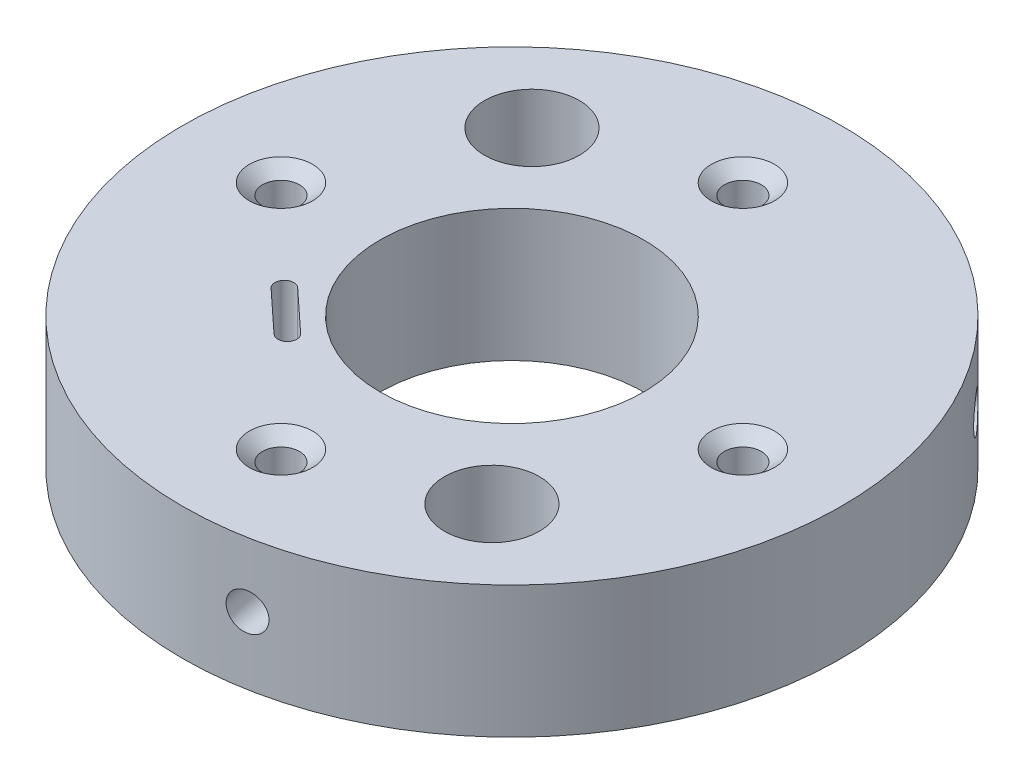
ISO-10303-21;
HEADER;
FILE_DESCRIPTION(('STEP AP214'),'2;1');
FILE_NAME('part.step','',(''),(''),'','','');
FILE_SCHEMA(('AUTOMOTIVE_DESIGN { 1 0 10303 214 1 1 1 1 }'));
ENDSEC;
DATA;
#1=APPLICATION_CONTEXT('core data for automotive mechanical design processes');
#2=APPLICATION_PROTOCOL_DEFINITION('international standard','automotive_design',2000,#1);
#3=PRODUCT_CONTEXT('',#1,'mechanical');
#4=PRODUCT('Part','Part','',(#3));
#5=PRODUCT_RELATED_PRODUCT_CATEGORY('part','',(#4));
#6=PRODUCT_DEFINITION_FORMATION('','',#4);
#7=PRODUCT_DEFINITION_CONTEXT('part definition',#1,'design');
#8=PRODUCT_DEFINITION('design','',#6,#7);
#9=PRODUCT_DEFINITION_SHAPE('','',#8);
#10=(LENGTH_UNIT() NAMED_UNIT(*) SI_UNIT(.MILLI.,.METRE.));
#11=(NAMED_UNIT(*) PLANE_ANGLE_UNIT() SI_UNIT($,.RADIAN.));
#12=(NAMED_UNIT(*) SI_UNIT($,.STERADIAN.) SOLID_ANGLE_UNIT());
#13=UNCERTAINTY_MEASURE_WITH_UNIT(LENGTH_MEASURE(1.E-05),#10,'distance_accuracy_value','');
#14=(GEOMETRIC_REPRESENTATION_CONTEXT(3) GLOBAL_UNCERTAINTY_ASSIGNED_CONTEXT((#13)) GLOBAL_UNIT_ASSIGNED_CONTEXT((#10,
#11,#12)) REPRESENTATION_CONTEXT('',''));
#15=CARTESIAN_POINT('',(0.,0.,0.));
#16=DIRECTION('',(0.,0.,1.));
#17=DIRECTION('',(1.,0.,0.));
#18=AXIS2_PLACEMENT_3D('',#15,#16,#17);
#19=CARTESIAN_POINT('',(0.,6.35,0.));
#20=DIRECTION('',(0.,-1.,0.));
#21=DIRECTION('',(0.,0.,-1.));
#22=AXIS2_PLACEMENT_3D('',#19,#20,#21);
#23=CYLINDRICAL_SURFACE('',#22,15.875);
#24=CARTESIAN_POINT('',(-15.2282915703805,3.24498727480954,-4.48494825471575));
#25=CARTESIAN_POINT('',(-15.2282911465796,3.19509377746798,-4.48495043826748));
#26=CARTESIAN_POINT('',(-15.2271007069636,3.14516509937447,-4.48899789228401));
#27=CARTESIAN_POINT('',(-15.2223503294646,3.0466856886438,-4.50507969230698));
#28=CARTESIAN_POINT('',(-15.2187876150216,2.99813664026207,-4.51712339724458));
#29=CARTESIAN_POINT('',(-15.2093401405173,2.90385727583392,-4.54883167071027));
#30=CARTESIAN_POINT('',(-15.2034565831338,2.85812551401789,-4.56849229200275));
#31=CARTESIAN_POINT('',(-15.18945222642,2.77076349097647,-4.61484011490653));
#32=CARTESIAN_POINT('',(-15.1813319480101,2.72913227781618,-4.64152568038166));
#33=CARTESIAN_POINT('',(-15.1629694645935,2.65108952848131,-4.70116514057103));
#34=CARTESIAN_POINT('',(-15.1527249674584,2.6146837031448,-4.73412580322891));
#35=CARTESIAN_POINT('',(-15.1302961191531,2.5481739418141,-4.80532564168976));
#36=CARTESIAN_POINT('',(-15.1181116880585,2.5180702655839,-4.84356503496536));
#37=CARTESIAN_POINT('',(-15.0920310280375,2.46500271829502,-4.92422781041905));
#38=CARTESIAN_POINT('',(-15.0781337085461,2.44204342906373,-4.96665385469964));
#39=CARTESIAN_POINT('',(-15.0489356594865,2.40394575594215,-5.05443347623817));
#40=CARTESIAN_POINT('',(-15.0336349425296,2.38880730177935,-5.09978702718749));
#41=CARTESIAN_POINT('',(-15.0020168731493,2.36679647628499,-5.19206023230263));
#42=CARTESIAN_POINT('',(-14.9857006147186,2.35991536645124,-5.23897817675925));
#43=CARTESIAN_POINT('',(-14.9524703575978,2.35458758265016,-5.33308022415644));
#44=CARTESIAN_POINT('',(-14.9355563645334,2.35614082932302,-5.38026432458854));
#45=CARTESIAN_POINT('',(-14.9016379735073,2.36763043679299,-5.47350617396945));
#46=CARTESIAN_POINT('',(-14.8846336981962,2.37755739477769,-5.51956512667726));
#47=CARTESIAN_POINT('',(-14.8510415722875,2.40549805193343,-5.60932143976133));
#48=CARTESIAN_POINT('',(-14.8344537237617,2.42351179132791,-5.65301878838983));
#49=CARTESIAN_POINT('',(-14.8022298173461,2.46712535527587,-5.73686657923088));
#50=CARTESIAN_POINT('',(-14.7865943016638,2.49272945359471,-5.77701500663982));
#51=CARTESIAN_POINT('',(-14.7568253546586,2.5507938138994,-5.85263911597684));
#52=CARTESIAN_POINT('',(-14.7426919367936,2.5832541373047,-5.8881147560405));
#53=CARTESIAN_POINT('',(-14.7164188808589,2.65416265144211,-5.95347676891181));
#54=CARTESIAN_POINT('',(-14.7042820066023,2.69261900148294,-5.98335540159032));
#55=CARTESIAN_POINT('',(-14.6824808122755,2.77439930600382,-6.03665587250962));
#56=CARTESIAN_POINT('',(-14.6728164929975,2.81772326204371,-6.06007770868127));
#57=CARTESIAN_POINT('',(-14.6563335329688,2.9080140508908,-6.09983424636846));
#58=CARTESIAN_POINT('',(-14.6495150137259,2.95498103914388,-6.1161686452712));
#59=CARTESIAN_POINT('',(-14.6389940553844,3.05122236236581,-6.14130811433626));
#60=CARTESIAN_POINT('',(-14.6352915868809,3.10049667555668,-6.15011325554937));
#61=CARTESIAN_POINT('',(-14.6311541176964,3.19988229403718,-6.15994993760289));
#62=CARTESIAN_POINT('',(-14.6307146869629,3.24999237192321,-6.16099201794357));
#63=CARTESIAN_POINT('',(-14.6331092864187,3.34969005124424,-6.1553023297484));
#64=CARTESIAN_POINT('',(-14.6359433029784,3.39927765485379,-6.14857059358029));
#65=CARTESIAN_POINT('',(-14.6447681403672,3.49649061392205,-6.12752151153869));
#66=CARTESIAN_POINT('',(-14.6507569453719,3.54411720148917,-6.11320900953766));
#67=CARTESIAN_POINT('',(-14.6656530410876,3.63609417405322,-6.07738595170163));
#68=CARTESIAN_POINT('',(-14.6745603530319,3.68044453521155,-6.05587534349782));
#69=CARTESIAN_POINT('',(-14.6949592011738,3.76466259107783,-6.00620661402808));
#70=CARTESIAN_POINT('',(-14.7064535131237,3.80452540137983,-5.97804135094335));
#71=CARTESIAN_POINT('',(-14.7315868686079,3.87858763200712,-5.91583432040391));
#72=CARTESIAN_POINT('',(-14.7452259291451,3.91278700742987,-5.88179250636133));
#73=CARTESIAN_POINT('',(-14.7741673746068,3.97459002336614,-5.8087129991228));
#74=CARTESIAN_POINT('',(-14.7894715929462,4.00218628442217,-5.76966979060401));
#75=CARTESIAN_POINT('',(-14.8211937495681,4.04994924586241,-5.68768583687366));
#76=CARTESIAN_POINT('',(-14.8376116820844,4.0701159847091,-5.64474511184091));
#77=CARTESIAN_POINT('',(-14.8710024683561,4.10243456843035,-5.55618097769274));
#78=CARTESIAN_POINT('',(-14.8879749907001,4.11459111131441,-5.51055915818266));
#79=CARTESIAN_POINT('',(-14.9219485254046,4.13055960381129,-5.41788812238306));
#80=CARTESIAN_POINT('',(-14.9389495375493,4.13437161633567,-5.37083891685768));
#81=CARTESIAN_POINT('',(-14.9724558227592,4.13354224193131,-5.27671147633834));
#82=CARTESIAN_POINT('',(-14.9889617424862,4.12891241788758,-5.2296333692135));
#83=CARTESIAN_POINT('',(-15.0210541676162,4.11135472973728,-5.13672785715275));
#84=CARTESIAN_POINT('',(-15.0366406713351,4.09842685043214,-5.09090045450777));
#85=CARTESIAN_POINT('',(-15.0665085044823,4.06464251543631,-5.00181522059626));
#86=CARTESIAN_POINT('',(-15.0807898319151,4.04378604762455,-4.95855739325818));
#87=CARTESIAN_POINT('',(-15.1077283540365,3.99473836047828,-4.87586530142134));
#88=CARTESIAN_POINT('',(-15.1203855950618,3.96654735047478,-4.83643092784366));
#89=CARTESIAN_POINT('',(-15.14383879164,3.90358866993637,-4.76248683829095));
#90=CARTESIAN_POINT('',(-15.1546323865691,3.86881277368339,-4.72798337754348));
#91=CARTESIAN_POINT('',(-15.1741487687945,3.79368003271757,-4.66496789625191));
#92=CARTESIAN_POINT('',(-15.1828710471827,3.75332182031413,-4.63645734832273));
#93=CARTESIAN_POINT('',(-15.1981100389942,3.66813184901027,-4.58625853406227));
#94=CARTESIAN_POINT('',(-15.2046243464589,3.62329527859266,-4.56457771167877));
#95=CARTESIAN_POINT('',(-15.2153340924957,3.53048920558535,-4.52875108392476));
#96=CARTESIAN_POINT('',(-15.2195322598485,3.48252346451599,-4.51459641226981));
#97=CARTESIAN_POINT('',(-15.2244592872742,3.40271600545339,-4.49794471033176));
#98=CARTESIAN_POINT('',(-15.2258953880023,3.37139075222807,-4.49307759729627));
#99=CARTESIAN_POINT('',(-15.2278116636737,3.3083774918506,-4.48657867754605));
#100=CARTESIAN_POINT('',(-15.2282918396626,3.27668948509531,-4.48494686729214));
#101=CARTESIAN_POINT('',(-15.2282915703805,3.24498727480954,-4.48494825471575));
#102=B_SPLINE_CURVE_WITH_KNOTS('',3,(#24,#25,#26,#27,#28,#29,#30,#31,#32,#33,#34,#35,#36,#37,
#38,#39,#40,#41,#42,#43,#44,#45,#46,#47,#48,#49,#50,#51,#52,#53,#54,#55,#56,#57,#58,#59,#60,#61,
#62,#63,#64,#65,#66,#67,#68,#69,#70,#71,#72,#73,#74,#75,#76,#77,#78,#79,#80,#81,#82,#83,#84,#85,
#86,#87,#88,#89,#90,#91,#92,#93,#94,#95,#96,#97,#98,#99,#100,#101),.UNSPECIFIED.,.T.,.F.,(4,2,2,
2,2,2,2,2,2,2,2,2,2,2,2,2,2,2,2,2,2,2,2,2,2,2,2,2,2,2,2,2,2,2,2,2,2,2,4),(0.,0.149564763363244,
0.299304888872072,0.448967519681347,0.598595324287345,0.748385432208139,0.898181713010173,
1.04807386388305,1.1979646679077,1.3476967066616,1.49742733657222,1.64699005793007,
1.79655352321713,1.94620136094861,2.09585053931258,2.2457051646573,2.39555983802419,
2.54542090911676,2.69528056601084,2.84493672917176,2.9945922692132,3.14415229919697,
3.29371341730751,3.44343578035771,3.59315933042515,3.7430494339239,3.89293876143384,
4.04274009986518,4.19254030890202,4.34213548890545,4.49173094290555,4.64132662560495,
4.79091803924718,4.94069756745058,5.09051385747455,5.24049287681918,5.39029481765828,
5.48532801875747,5.58036111589684),.UNSPECIFIED.);
#103=CARTESIAN_POINT('',(-15.2282915703805,3.24498727480954,-4.48494825471575));
#104=VERTEX_POINT('',#103);
#105=EDGE_CURVE('E11',#104,#104,#102,.T.);
#106=ORIENTED_EDGE('',*,*,#105,.T.);
#107=EDGE_LOOP('',(#106));
#108=FACE_BOUND('',#107,.T.);
#109=CARTESIAN_POINT('',(3.73006666194781,3.24498727480954,15.4305614835438));
#110=CARTESIAN_POINT('',(3.73006455903606,3.19509377746798,15.4305622082973));
#111=CARTESIAN_POINT('',(3.72596414122915,3.14516509937447,15.4315549843565));
#112=CARTESIAN_POINT('',(3.70966170512117,3.0466856886438,15.4354819367763));
#113=CARTESIAN_POINT('',(3.69745019346799,2.99813664026207,15.438418388031));
#114=CARTESIAN_POINT('',(3.66526628588443,2.90385727583392,15.4460907718415));
#115=CARTESIAN_POINT('',(3.64529790969921,2.85812551401789,15.450825772329));
#116=CARTESIAN_POINT('',(3.59815733929753,2.77076349097647,15.4618715551031));
#117=CARTESIAN_POINT('',(3.57098682247676,2.72913227781617,15.4681819704519));
#118=CARTESIAN_POINT('',(3.51015629317646,2.65108952848131,15.4820993234312));
#119=CARTESIAN_POINT('',(3.47648927342164,2.6146837031448,15.4897076599922));
#120=CARTESIAN_POINT('',(3.40361398041655,2.5481739418141,15.5058836268126));
#121=CARTESIAN_POINT('',(3.36440547886727,2.5180702655839,15.5144512965918));
#122=CARTESIAN_POINT('',(3.28150913617409,2.46500271829502,15.5321961701929));
#123=CARTESIAN_POINT('',(3.23781844429933,2.44204342906373,15.5413737606092));
#124=CARTESIAN_POINT('',(3.14720003758257,2.40394575594215,15.5599773191519));
#125=CARTESIAN_POINT('',(3.10027235183021,2.38880730177935,15.5694032850458));
#126=CARTESIAN_POINT('',(3.00455237742171,2.36679647628499,15.5881578363014));
#127=CARTESIAN_POINT('',(2.95576211641356,2.35991536645124,15.597486514234));
#128=CARTESIAN_POINT('',(2.85765222425909,2.35458758265016,15.6157592910917));
#129=CARTESIAN_POINT('',(2.80833259809799,2.35614082932302,15.6247033936346));
#130=CARTESIAN_POINT('',(2.71062359232523,2.36763043679299,15.6419501300409));
#131=CARTESIAN_POINT('',(2.66223323155299,2.37755739477769,15.6502534720024));
#132=CARTESIAN_POINT('',(2.56770592131781,2.40549805193343,15.6660399941404));
#133=CARTESIAN_POINT('',(2.52156898306461,2.42351179132791,15.6735231702372));
#134=CARTESIAN_POINT('',(2.43284271293725,2.46712535527587,15.6875403440926));
#135=CARTESIAN_POINT('',(2.39025539703794,2.49272945359471,15.6940738040149));
#136=CARTESIAN_POINT('',(2.30987852371092,2.5507938138994,15.706105194333));
#137=CARTESIAN_POINT('',(2.27208900926777,2.5832541373047,15.7116031154515));
#138=CARTESIAN_POINT('',(2.20234731771139,2.65416265144211,15.7215309880126));
#139=CARTESIAN_POINT('',(2.17040322565318,2.69261900148294,15.7259594629232));
#140=CARTESIAN_POINT('',(2.11334306663997,2.77439930600382,15.7337293102629));
#141=CARTESIAN_POINT('',(2.08822700187306,2.81772326204371,15.7370706823438));
#142=CARTESIAN_POINT('',(2.0455553502551,2.9080140508908,15.742674289073));
#143=CARTESIAN_POINT('',(2.02800008622831,2.95498103914388,15.7449364776438));
#144=CARTESIAN_POINT('',(2.00096818820958,3.05122236236581,15.7483947949804));
#145=CARTESIAN_POINT('',(1.99149147798335,3.10049667555668,15.7495909338062));
#146=CARTESIAN_POINT('',(1.98090392684379,3.19988229403718,15.7509261214118));
#147=CARTESIAN_POINT('',(1.97978174342922,3.24999237192321,15.7510666034037));
#148=CARTESIAN_POINT('',(1.98590645767375,3.34969005124424,15.7502955432667));
#149=CARTESIAN_POINT('',(1.99315332048675,3.39927765485378,15.7493840055181));
#150=CARTESIAN_POINT('',(2.01579477895555,3.49649061392205,15.7465019978603));
#151=CARTESIAN_POINT('',(2.03118417178249,3.54411720148917,15.7445322041322));
#152=CARTESIAN_POINT('',(2.06965589776762,3.63609417405322,15.7395210725212));
#153=CARTESIAN_POINT('',(2.09273828689511,3.68044453521155,15.7364797268425));
#154=CARTESIAN_POINT('',(2.14595209246054,3.76466259107783,15.7293112828064));
#155=CARTESIAN_POINT('',(2.17609108177116,3.80452540137983,15.7251830174117));
#156=CARTESIAN_POINT('',(2.24253062825439,3.87858763200712,15.7158456264736));
#157=CARTESIAN_POINT('',(2.27883123427477,3.91278700742987,15.7106364923613));
#158=CARTESIAN_POINT('',(2.35659066677021,3.97459002336614,15.6991607657341));
#159=CARTESIAN_POINT('',(2.39805518636247,4.00218628442217,15.6928930033417));
#160=CARTESIAN_POINT('',(2.48491645130659,4.04994924586241,15.679373219974));
#161=CARTESIAN_POINT('',(2.53031317630002,4.0701159847091,15.6721212040943));
#162=CARTESIAN_POINT('',(2.62370735947234,4.10243456843035,15.6567564061838));
#163=CARTESIAN_POINT('',(2.67170327530697,4.11459111131441,15.648644131945));
#164=CARTESIAN_POINT('',(2.76894551385669,4.13055960381129,15.6317305581557));
#165=CARTESIAN_POINT('',(2.81819182714188,4.13437161633567,15.6229292638003));
#166=CARTESIAN_POINT('',(2.91646172442977,4.13354224193131,15.6048828377188));
#167=CARTESIAN_POINT('',(2.96548552102548,4.12891241788758,15.5956383299529));
#168=CARTESIAN_POINT('',(3.06199026718669,4.11135472973729,15.5769784293541));
#169=CARTESIAN_POINT('',(3.10947121392617,4.09842685043215,15.5675630362084));
#170=CARTESIAN_POINT('',(3.20155520616917,4.06464251543631,15.548886721514));
#171=CARTESIAN_POINT('',(3.24615824727289,4.04378604762455,15.5396258002016));
#172=CARTESIAN_POINT('',(3.33124096055636,3.99473836047828,15.5216091987807));
#173=CARTESIAN_POINT('',(3.3717207503696,3.96654735047478,15.5128535042616));
#174=CARTESIAN_POINT('',(3.44748480867109,3.90358866993637,15.496192523522));
#175=CARTESIAN_POINT('',(3.4827624796614,3.8688127736834,15.4882883205549));
#176=CARTESIAN_POINT('',(3.54709367840434,3.79368003271757,15.4736822627064));
#177=CARTESIAN_POINT('',(3.57614567638089,3.75332182031413,15.4669807034048));
#178=CARTESIAN_POINT('',(3.62723862067607,3.66813184901027,15.4550786503114));
#179=CARTESIAN_POINT('',(3.64927191736748,3.62329527859266,15.4498797948722));
#180=CARTESIAN_POINT('',(3.68565356015279,3.53048920558535,15.4412413931311));
#181=CARTESIAN_POINT('',(3.70001094906461,3.48252346451599,15.4377997768805));
#182=CARTESIAN_POINT('',(3.71689525967203,3.40271600545339,15.4337408568272));
#183=CARTESIAN_POINT('',(3.7218283535679,3.37139075222807,15.4325510000224));
#184=CARTESIAN_POINT('',(3.72841472100442,3.3083774918506,15.4309610835594));
#185=CARTESIAN_POINT('',(3.73006799813297,3.27668948509531,15.4305610230372));
#186=CARTESIAN_POINT('',(3.73006666194781,3.24498727480954,15.4305614835438));
#187=B_SPLINE_CURVE_WITH_KNOTS('',3,(#109,#110,#111,#112,#113,#114,#115,#116,#117,#118,#119,
#120,#121,#122,#123,#124,#125,#126,#127,#128,#129,#130,#131,#132,#133,#134,#135,#136,#137,#138,
#139,#140,#141,#142,#143,#144,#145,#146,#147,#148,#149,#150,#151,#152,#153,#154,#155,#156,#157,
#158,#159,#160,#161,#162,#163,#164,#165,#166,#167,#168,#169,#170,#171,#172,#173,#174,#175,#176,
#177,#178,#179,#180,#181,#182,#183,#184,#185,#186),.UNSPECIFIED.,.T.,.F.,(4,2,2,2,2,2,2,2,2,2,2,
2,2,2,2,2,2,2,2,2,2,2,2,2,2,2,2,2,2,2,2,2,2,2,2,2,2,2,4),(0.,0.149564763363244,
0.299304888872072,0.448967519681348,0.598595324287345,0.74838543220814,0.898181713010173,
1.04807386388305,1.1979646679077,1.3476967066616,1.49742733657222,1.64699005793006,
1.79655352321713,1.94620136094861,2.09585053931258,2.2457051646573,2.39555983802419,
2.54542090911676,2.69528056601084,2.84493672917176,2.9945922692132,3.14415229919697,
3.29371341730751,3.44343578035771,3.59315933042515,3.7430494339239,3.89293876143383,
4.04274009986518,4.19254030890202,4.34213548890545,4.49173094290555,4.64132662560495,
4.79091803924718,4.94069756745058,5.09051385747455,5.24049287681918,5.39029481765828,
5.48532801875747,5.58036111589684),.UNSPECIFIED.);
#188=CARTESIAN_POINT('',(3.73006666194781,3.24498727480954,15.4305614835438));
#189=VERTEX_POINT('',#188);
#190=EDGE_CURVE('E52',#189,#189,#187,.T.);
#191=ORIENTED_EDGE('',*,*,#190,.T.);
#192=EDGE_LOOP('',(#191));
#193=FACE_BOUND('',#192,.T.);
#194=CARTESIAN_POINT('',(11.4982249084327,3.24498727480954,-10.9456132288282));
#195=CARTESIAN_POINT('',(11.4982265875435,3.19509377746798,-10.9456117700299));
#196=CARTESIAN_POINT('',(11.5011365657345,3.14516509937447,-10.9425570920726));
#197=CARTESIAN_POINT('',(11.5126886243434,3.0466856886438,-10.9304022444694));
#198=CARTESIAN_POINT('',(11.5213374215536,2.99813664026207,-10.9212949907865));
#199=CARTESIAN_POINT('',(11.5440738546329,2.90385727583392,-10.8972591011314));
#200=CARTESIAN_POINT('',(11.5581586734346,2.85812551401789,-10.8823334803264));
#201=CARTESIAN_POINT('',(11.5912948871225,2.77076349097647,-10.8470314401967));
#202=CARTESIAN_POINT('',(11.6103451255333,2.72913227781618,-10.8266562900703));
#203=CARTESIAN_POINT('',(11.652813171417,2.65108952848131,-10.7809341828603));
#204=CARTESIAN_POINT('',(11.6762356940368,2.6146837031448,-10.7555818567634));
#205=CARTESIAN_POINT('',(11.7266821387366,2.5481739418141,-10.700557985123));
#206=CARTESIAN_POINT('',(11.7537062091912,2.5180702655839,-10.6708862616265));
#207=CARTESIAN_POINT('',(11.8105218918634,2.46500271829502,-10.607968359774));
#208=CARTESIAN_POINT('',(11.8403152642467,2.44204342906373,-10.5747199059097));
#209=CARTESIAN_POINT('',(11.9017356219039,2.40394575594215,-10.5055438429139));
#210=CARTESIAN_POINT('',(11.9333625906994,2.38880730177935,-10.4696162578584));
#211=CARTESIAN_POINT('',(11.9974644957276,2.36679647628499,-10.3960976039989));
#212=CARTESIAN_POINT('',(12.029938498305,2.35991536645124,-10.3585083374748));
#213=CARTESIAN_POINT('',(12.0948181333387,2.35458758265016,-10.2826790669354));
#214=CARTESIAN_POINT('',(12.1272237664354,2.35614082932302,-10.2444390690462));
#215=CARTESIAN_POINT('',(12.1910143811821,2.36763043679299,-10.1684439560716));
#216=CARTESIAN_POINT('',(12.2224004666432,2.37755739477769,-10.1306883453253));
#217=CARTESIAN_POINT('',(12.2833356509697,2.40549805193343,-10.0567185543792));
#218=CARTESIAN_POINT('',(12.3128847406971,2.42351179132791,-10.0205043818475));
#219=CARTESIAN_POINT('',(12.3693871044088,2.46712535527587,-9.9506737648619));
#220=CARTESIAN_POINT('',(12.3963389046258,2.49272945359471,-9.91705879737524));
#221=CARTESIAN_POINT('',(12.4469468309476,2.5507938138994,-9.85346607835634));
#222=CARTESIAN_POINT('',(12.4706029275258,2.5832541373047,-9.82348835941109));
#223=CARTESIAN_POINT('',(12.5140715631475,2.65416265144211,-9.76805421910096));
#224=CARTESIAN_POINT('',(12.5338787809491,2.69261900148294,-9.742604061333));
#225=CARTESIAN_POINT('',(12.5691377456355,2.77439930600382,-9.69707343775346));
#226=CARTESIAN_POINT('',(12.5845894911244,2.81772326204371,-9.67699297366263));
#227=CARTESIAN_POINT('',(12.6107781827137,2.9080140508908,-9.64284004270464));
#228=CARTESIAN_POINT('',(12.6215149274976,2.95498103914388,-9.6287678323727));
#229=CARTESIAN_POINT('',(12.6380258671748,3.05122236236581,-9.6070866806443));
#230=CARTESIAN_POINT('',(12.6438001088975,3.10049667555668,-9.59947767825697));
#231=CARTESIAN_POINT('',(12.6502501908526,3.19988229403718,-9.59097618380902));
#232=CARTESIAN_POINT('',(12.6509329435336,3.24999237192321,-9.59007458546026));
#233=CARTESIAN_POINT('',(12.6472028287449,3.34969005124424,-9.59499321351846));
#234=CARTESIAN_POINT('',(12.6427899824916,3.39927765485378,-9.60081341193795));
#235=CARTESIAN_POINT('',(12.6289733614116,3.49649061392205,-9.61898048632177));
#236=CARTESIAN_POINT('',(12.6195727735894,3.54411720148917,-9.63132319459464));
#237=CARTESIAN_POINT('',(12.59599714332,3.63609417405322,-9.66213512081971));
#238=CARTESIAN_POINT('',(12.5818220661368,3.68044453521155,-9.68060438334479));
#239=CARTESIAN_POINT('',(12.5490071087132,3.76466259107783,-9.72310466877847));
#240=CARTESIAN_POINT('',(12.5303624313526,3.80452540137982,-9.7471416664685));
#241=CARTESIAN_POINT('',(12.4890562403535,3.87858763200712,-9.80001130606986));
#242=CARTESIAN_POINT('',(12.4663946948703,3.91278700742987,-9.82884398600012));
#243=CARTESIAN_POINT('',(12.4175767078365,3.97459002336614,-9.89044776661141));
#244=CARTESIAN_POINT('',(12.3914164065837,4.00218628442217,-9.92322321273784));
#245=CARTESIAN_POINT('',(12.3362772982615,4.04994924586241,-9.99168738310043));
#246=CARTESIAN_POINT('',(12.3072985057844,4.0701159847091,-10.0273760922535));
#247=CARTESIAN_POINT('',(12.2472951088837,4.10243456843035,-10.1005754284912));
#248=CARTESIAN_POINT('',(12.2162717153931,4.11459111131441,-10.1380849737625));
#249=CARTESIAN_POINT('',(12.1530030115479,4.13055960381129,-10.2138424357727));
#250=CARTESIAN_POINT('',(12.1207577104074,4.13437161633567,-10.2520903469428));
#251=CARTESIAN_POINT('',(12.0559940983294,4.13354224193131,-10.3281713613806));
#252=CARTESIAN_POINT('',(12.0234762214607,4.12891241788758,-10.3660049607395));
#253=CARTESIAN_POINT('',(11.9590639004295,4.11135472973729,-10.4402505722015));
#254=CARTESIAN_POINT('',(11.9271694574089,4.09842685043215,-10.4766625817008));
#255=CARTESIAN_POINT('',(11.8649532983131,4.06464251543631,-10.5470715009179));
#256=CARTESIAN_POINT('',(11.8346315846422,4.04378604762455,-10.5810684069435));
#257=CARTESIAN_POINT('',(11.7764873934801,3.99473836047828,-10.6457438973595));
#258=CARTESIAN_POINT('',(11.7486648446921,3.96654735047478,-10.676422576418));
#259=CARTESIAN_POINT('',(11.6963539829689,3.90358866993637,-10.7337056852311));
#260=CARTESIAN_POINT('',(11.6718699069076,3.86881277368339,-10.7603049430116));
#261=CARTESIAN_POINT('',(11.6270550903902,3.79368003271757,-10.8087143664546));
#262=CARTESIAN_POINT('',(11.6067253708018,3.75332182031413,-10.8305233550822));
#263=CARTESIAN_POINT('',(11.5708714183181,3.66813184901027,-10.8688201162493));
#264=CARTESIAN_POINT('',(11.5553524290914,3.62329527859266,-10.8853020831935));
#265=CARTESIAN_POINT('',(11.5296805323429,3.53048920558535,-10.9124903092065));
#266=CARTESIAN_POINT('',(11.5195213107839,3.48252346451599,-10.9232033646108));
#267=CARTESIAN_POINT('',(11.5075640276021,3.40271600545339,-10.9357961464956));
#268=CARTESIAN_POINT('',(11.5040670344344,3.37139075222807,-10.9394734027263));
#269=CARTESIAN_POINT('',(11.4993969426692,3.3083774918506,-10.9443824060134));
#270=CARTESIAN_POINT('',(11.4982238415296,3.27668948509531,-10.9456141557452));
#271=CARTESIAN_POINT('',(11.4982249084327,3.24498727480954,-10.9456132288282));
#272=B_SPLINE_CURVE_WITH_KNOTS('',3,(#194,#195,#196,#197,#198,#199,#200,#201,#202,#203,#204,
#205,#206,#207,#208,#209,#210,#211,#212,#213,#214,#215,#216,#217,#218,#219,#220,#221,#222,#223,
#224,#225,#226,#227,#228,#229,#230,#231,#232,#233,#234,#235,#236,#237,#238,#239,#240,#241,#242,
#243,#244,#245,#246,#247,#248,#249,#250,#251,#252,#253,#254,#255,#256,#257,#258,#259,#260,#261,
#262,#263,#264,#265,#266,#267,#268,#269,#270,#271),.UNSPECIFIED.,.T.,.F.,(4,2,2,2,2,2,2,2,2,2,2,
2,2,2,2,2,2,2,2,2,2,2,2,2,2,2,2,2,2,2,2,2,2,2,2,2,2,2,4),(0.,0.149564763363245,
0.299304888872072,0.448967519681347,0.598595324287345,0.748385432208138,0.898181713010171,
1.04807386388305,1.1979646679077,1.3476967066616,1.49742733657222,1.64699005793007,
1.79655352321713,1.94620136094861,2.09585053931258,2.2457051646573,2.39555983802419,
2.54542090911676,2.69528056601084,2.84493672917176,2.9945922692132,3.14415229919697,
3.29371341730751,3.44343578035771,3.59315933042515,3.7430494339239,3.89293876143383,
4.04274009986518,4.19254030890202,4.34213548890545,4.49173094290555,4.64132662560495,
4.79091803924719,4.94069756745058,5.09051385747455,5.24049287681918,5.39029481765828,
5.48532801875748,5.58036111589684),.UNSPECIFIED.);
#273=CARTESIAN_POINT('',(11.4982249084327,3.24498727480954,-10.9456132288282));
#274=VERTEX_POINT('',#273);
#275=EDGE_CURVE('E203',#274,#274,#272,.T.);
#276=ORIENTED_EDGE('',*,*,#275,.T.);
#277=EDGE_LOOP('',(#276));
#278=FACE_BOUND('',#277,.T.);
#279=CARTESIAN_POINT('',(0.,6.35,0.));
#280=DIRECTION('',(0.,1.,0.));
#281=DIRECTION('',(0.,0.,1.));
#282=AXIS2_PLACEMENT_3D('',#279,#280,#281);
#283=CIRCLE('',#282,15.875);
#284=CARTESIAN_POINT('',(0.,6.35,15.875));
#285=VERTEX_POINT('',#284);
#286=EDGE_CURVE('E200',#285,#285,#283,.T.);
#287=ORIENTED_EDGE('',*,*,#286,.F.);
#288=EDGE_LOOP('',(#287));
#289=FACE_BOUND('',#288,.T.);
#290=CARTESIAN_POINT('',(0.,0.,0.));
#291=DIRECTION('',(0.,1.,0.));
#292=DIRECTION('',(0.,0.,1.));
#293=AXIS2_PLACEMENT_3D('',#290,#291,#292);
#294=CIRCLE('',#293,15.875);
#295=CARTESIAN_POINT('',(0.,0.,15.875));
#296=VERTEX_POINT('',#295);
#297=EDGE_CURVE('E197',#296,#296,#294,.T.);
#298=ORIENTED_EDGE('',*,*,#297,.T.);
#299=EDGE_LOOP('',(#298));
#300=FACE_BOUND('',#299,.T.);
#301=ADVANCED_FACE('F40',(#108,#193,#278,#289,#300),#23,.T.);
#302=CARTESIAN_POINT('',(0.,6.35,0.));
#303=DIRECTION('',(0.,1.,0.));
#304=DIRECTION('',(0.,0.,1.));
#305=AXIS2_PLACEMENT_3D('',#302,#303,#304);
#306=PLANE('',#305);
#307=CARTESIAN_POINT('',(-4.66085783906229,6.35,6.15769241715111));
#308=DIRECTION('',(0.,1.,0.));
#309=DIRECTION('',(0.,0.,1.));
#310=AXIS2_PLACEMENT_3D('',#307,#308,#309);
#311=CIRCLE('',#310,0.453239993589716);
#312=CARTESIAN_POINT('',(-4.96914614961054,6.35,6.4899345116673));
#313=VERTEX_POINT('',#312);
#314=CARTESIAN_POINT('',(-4.35256952851403,6.35,5.82545032263492));
#315=VERTEX_POINT('',#314);
#316=EDGE_CURVE('E59',#313,#315,#311,.T.);
#317=ORIENTED_EDGE('',*,*,#316,.F.);
#318=DIRECTION('',(0.733037903131172,0.,0.680187792137623));
#319=VECTOR('',#318,1.);
#320=CARTESIAN_POINT('',(-4.96914614961054,6.35,6.4899345116673));
#321=LINE('',#320,#319);
#322=CARTESIAN_POINT('',(-6.95581081391858,6.35,4.64650316117175));
#323=VERTEX_POINT('',#322);
#324=EDGE_CURVE('E118',#323,#313,#321,.T.);
#325=ORIENTED_EDGE('',*,*,#324,.F.);
#326=CARTESIAN_POINT('',(-6.64752250337032,6.35,4.31426106665556));
#327=DIRECTION('',(0.,1.,0.));
#328=DIRECTION('',(0.,0.,1.));
#329=AXIS2_PLACEMENT_3D('',#326,#327,#328);
#330=CIRCLE('',#329,0.453239993589716);
#331=CARTESIAN_POINT('',(-6.33923419282206,6.35,3.98201897213937));
#332=VERTEX_POINT('',#331);
#333=EDGE_CURVE('E121',#332,#323,#330,.T.);
#334=ORIENTED_EDGE('',*,*,#333,.F.);
#335=DIRECTION('',(-0.733037903131172,0.,-0.680187792137623));
#336=VECTOR('',#335,1.);
#337=CARTESIAN_POINT('',(-4.35256952851403,6.35,5.82545032263492));
#338=LINE('',#337,#336);
#339=EDGE_CURVE('E127',#315,#332,#338,.T.);
#340=ORIENTED_EDGE('',*,*,#339,.F.);
#341=EDGE_LOOP('',(#317,#325,#334,#340));
#342=FACE_BOUND('',#341,.T.);
#343=CARTESIAN_POINT('',(7.36085690765695,6.35,8.32498899909177));
#344=DIRECTION('',(0.,1.,0.));
#345=DIRECTION('',(0.,0.,-1.));
#346=AXIS2_PLACEMENT_3D('',#343,#344,#345);
#347=CIRCLE('',#346,2.286);
#348=CARTESIAN_POINT('',(7.36085690765695,6.35,6.03898899909177));
#349=VERTEX_POINT('',#348);
#350=EDGE_CURVE('E145',#349,#349,#347,.T.);
#351=ORIENTED_EDGE('',*,*,#350,.F.);
#352=EDGE_LOOP('',(#351));
#353=FACE_BOUND('',#352,.T.);
#354=CARTESIAN_POINT('',(-7.36085690765695,6.35,-8.32498899909177));
#355=DIRECTION('',(0.,1.,0.));
#356=DIRECTION('',(0.,0.,1.));
#357=AXIS2_PLACEMENT_3D('',#354,#355,#356);
#358=CIRCLE('',#357,2.286);
#359=CARTESIAN_POINT('',(-7.36085690765695,6.35,-6.03898899909177));
#360=VERTEX_POINT('',#359);
#361=EDGE_CURVE('E149',#360,#360,#358,.T.);
#362=ORIENTED_EDGE('',*,*,#361,.F.);
#363=EDGE_LOOP('',(#362));
#364=FACE_BOUND('',#363,.T.);
#365=CARTESIAN_POINT('',(-11.1252,6.35,0.));
#366=DIRECTION('',(0.,1.,0.));
#367=DIRECTION('',(0.,0.,1.));
#368=AXIS2_PLACEMENT_3D('',#365,#366,#367);
#369=CIRCLE('',#368,1.524);
#370=CARTESIAN_POINT('',(-11.1252,6.35,1.524));
#371=VERTEX_POINT('',#370);
#372=EDGE_CURVE('E155',#371,#371,#369,.T.);
#373=ORIENTED_EDGE('',*,*,#372,.F.);
#374=EDGE_LOOP('',(#373));
#375=FACE_BOUND('',#374,.T.);
#376=CARTESIAN_POINT('',(11.1252,6.35,0.));
#377=DIRECTION('',(0.,1.,0.));
#378=DIRECTION('',(0.,0.,1.));
#379=AXIS2_PLACEMENT_3D('',#376,#377,#378);
#380=CIRCLE('',#379,1.524);
#381=CARTESIAN_POINT('',(11.1252,6.35,1.524));
#382=VERTEX_POINT('',#381);
#383=EDGE_CURVE('E166',#382,#382,#380,.T.);
#384=ORIENTED_EDGE('',*,*,#383,.F.);
#385=EDGE_LOOP('',(#384));
#386=FACE_BOUND('',#385,.T.);
#387=CARTESIAN_POINT('',(0.,6.35,11.1252));
#388=DIRECTION('',(0.,1.,0.));
#389=DIRECTION('',(0.,0.,1.));
#390=AXIS2_PLACEMENT_3D('',#387,#388,#389);
#391=CIRCLE('',#390,1.524);
#392=CARTESIAN_POINT('',(0.,6.35,12.6492));
#393=VERTEX_POINT('',#392);
#394=EDGE_CURVE('E175',#393,#393,#391,.T.);
#395=ORIENTED_EDGE('',*,*,#394,.F.);
#396=EDGE_LOOP('',(#395));
#397=FACE_BOUND('',#396,.T.);
#398=CARTESIAN_POINT('',(0.,6.35,-11.1252));
#399=DIRECTION('',(0.,1.,0.));
#400=DIRECTION('',(0.,0.,1.));
#401=AXIS2_PLACEMENT_3D('',#398,#399,#400);
#402=CIRCLE('',#401,1.524);
#403=CARTESIAN_POINT('',(0.,6.35,-9.6012));
#404=VERTEX_POINT('',#403);
#405=EDGE_CURVE('E184',#404,#404,#402,.T.);
#406=ORIENTED_EDGE('',*,*,#405,.F.);
#407=EDGE_LOOP('',(#406));
#408=FACE_BOUND('',#407,.T.);
#409=CARTESIAN_POINT('',(0.,6.35,0.));
#410=DIRECTION('',(0.,1.,0.));
#411=DIRECTION('',(0.,0.,1.));
#412=AXIS2_PLACEMENT_3D('',#409,#410,#411);
#413=CIRCLE('',#412,6.35);
#414=CARTESIAN_POINT('',(0.,6.35,6.35));
#415=VERTEX_POINT('',#414);
#416=EDGE_CURVE('E193',#415,#415,#413,.T.);
#417=ORIENTED_EDGE('',*,*,#416,.F.);
#418=EDGE_LOOP('',(#417));
#419=FACE_BOUND('',#418,.T.);
#420=ORIENTED_EDGE('',*,*,#286,.T.);
#421=EDGE_LOOP('',(#420));
#422=FACE_BOUND('',#421,.T.);
#423=ADVANCED_FACE('F279',(#342,#353,#364,#375,#386,#397,#408,#419,#422),#306,.T.);
#424=CARTESIAN_POINT('',(0.,0.,0.));
#425=DIRECTION('',(0.,1.,0.));
#426=DIRECTION('',(0.,0.,1.));
#427=AXIS2_PLACEMENT_3D('',#424,#425,#426);
#428=PLANE('',#427);
#429=DIRECTION('',(0.733037903131172,0.,0.680187792137623));
#430=VECTOR('',#429,1.);
#431=CARTESIAN_POINT('',(-4.96914614961054,0.,6.4899345116673));
#432=LINE('',#431,#430);
#433=CARTESIAN_POINT('',(-6.95581081391858,0.,4.64650316117175));
#434=VERTEX_POINT('',#433);
#435=CARTESIAN_POINT('',(-4.96914614961054,0.,6.4899345116673));
#436=VERTEX_POINT('',#435);
#437=EDGE_CURVE('E108',#434,#436,#432,.T.);
#438=ORIENTED_EDGE('',*,*,#437,.T.);
#439=CARTESIAN_POINT('',(-4.66085783906229,0.,6.15769241715111));
#440=DIRECTION('',(0.,1.,0.));
#441=DIRECTION('',(0.,0.,1.));
#442=AXIS2_PLACEMENT_3D('',#439,#440,#441);
#443=CIRCLE('',#442,0.453239993589716);
#444=CARTESIAN_POINT('',(-4.35256952851403,0.,5.82545032263492));
#445=VERTEX_POINT('',#444);
#446=EDGE_CURVE('E102',#436,#445,#443,.T.);
#447=ORIENTED_EDGE('',*,*,#446,.T.);
#448=DIRECTION('',(-0.733037903131172,0.,-0.680187792137623));
#449=VECTOR('',#448,1.);
#450=CARTESIAN_POINT('',(-4.35256952851403,0.,5.82545032263492));
#451=LINE('',#450,#449);
#452=CARTESIAN_POINT('',(-6.33923419282206,0.,3.98201897213937));
#453=VERTEX_POINT('',#452);
#454=EDGE_CURVE('E111',#445,#453,#451,.T.);
#455=ORIENTED_EDGE('',*,*,#454,.T.);
#456=CARTESIAN_POINT('',(-6.64752250337032,0.,4.31426106665556));
#457=DIRECTION('',(0.,1.,0.));
#458=DIRECTION('',(0.,0.,1.));
#459=AXIS2_PLACEMENT_3D('',#456,#457,#458);
#460=CIRCLE('',#459,0.453239993589716);
#461=EDGE_CURVE('E67',#453,#434,#460,.T.);
#462=ORIENTED_EDGE('',*,*,#461,.T.);
#463=EDGE_LOOP('',(#438,#447,#455,#462));
#464=FACE_BOUND('',#463,.T.);
#465=CARTESIAN_POINT('',(7.36085690765695,0.,8.32498899909177));
#466=DIRECTION('',(0.,1.,0.));
#467=DIRECTION('',(0.,0.,-1.));
#468=AXIS2_PLACEMENT_3D('',#465,#466,#467);
#469=CIRCLE('',#468,2.286);
#470=CARTESIAN_POINT('',(7.36085690765695,0.,6.03898899909177));
#471=VERTEX_POINT('',#470);
#472=EDGE_CURVE('E146',#471,#471,#469,.T.);
#473=ORIENTED_EDGE('',*,*,#472,.T.);
#474=EDGE_LOOP('',(#473));
#475=FACE_BOUND('',#474,.T.);
#476=CARTESIAN_POINT('',(-7.36085690765695,0.,-8.32498899909177));
#477=DIRECTION('',(0.,1.,0.));
#478=DIRECTION('',(0.,0.,1.));
#479=AXIS2_PLACEMENT_3D('',#476,#477,#478);
#480=CIRCLE('',#479,2.286);
#481=CARTESIAN_POINT('',(-7.36085690765695,0.,-6.03898899909177));
#482=VERTEX_POINT('',#481);
#483=EDGE_CURVE('E152',#482,#482,#480,.T.);
#484=ORIENTED_EDGE('',*,*,#483,.T.);
#485=EDGE_LOOP('',(#484));
#486=FACE_BOUND('',#485,.T.);
#487=CARTESIAN_POINT('',(0.,0.,11.1252));
#488=DIRECTION('',(0.,1.,0.));
#489=DIRECTION('',(0.,0.,1.));
#490=AXIS2_PLACEMENT_3D('',#487,#488,#489);
#491=CIRCLE('',#490,0.888999999999998);
#492=CARTESIAN_POINT('',(0.,0.,12.0142));
#493=VERTEX_POINT('',#492);
#494=EDGE_CURVE('E181',#493,#493,#491,.T.);
#495=ORIENTED_EDGE('',*,*,#494,.T.);
#496=EDGE_LOOP('',(#495));
#497=FACE_BOUND('',#496,.T.);
#498=CARTESIAN_POINT('',(0.,0.,-11.1252));
#499=DIRECTION('',(0.,1.,0.));
#500=DIRECTION('',(0.,0.,1.));
#501=AXIS2_PLACEMENT_3D('',#498,#499,#500);
#502=CIRCLE('',#501,0.888999999999998);
#503=CARTESIAN_POINT('',(0.,0.,-10.2362));
#504=VERTEX_POINT('',#503);
#505=EDGE_CURVE('E190',#504,#504,#502,.T.);
#506=ORIENTED_EDGE('',*,*,#505,.T.);
#507=EDGE_LOOP('',(#506));
#508=FACE_BOUND('',#507,.T.);
#509=CARTESIAN_POINT('',(0.,0.,0.));
#510=DIRECTION('',(0.,1.,0.));
#511=DIRECTION('',(0.,0.,1.));
#512=AXIS2_PLACEMENT_3D('',#509,#510,#511);
#513=CIRCLE('',#512,6.35);
#514=CARTESIAN_POINT('',(0.,0.,6.35));
#515=VERTEX_POINT('',#514);
#516=EDGE_CURVE('E194',#515,#515,#513,.T.);
#517=ORIENTED_EDGE('',*,*,#516,.T.);
#518=EDGE_LOOP('',(#517));
#519=FACE_BOUND('',#518,.T.);
#520=ORIENTED_EDGE('',*,*,#297,.F.);
#521=EDGE_LOOP('',(#520));
#522=FACE_BOUND('',#521,.T.);
#523=ADVANCED_FACE('F115',(#464,#475,#486,#497,#508,#519,#522),#428,.F.);
#524=CARTESIAN_POINT('',(0.,0.,0.));
#525=DIRECTION('',(0.,1.,0.));
#526=DIRECTION('',(0.,0.,1.));
#527=AXIS2_PLACEMENT_3D('',#524,#525,#526);
#528=CYLINDRICAL_SURFACE('',#527,6.35);
#529=ORIENTED_EDGE('',*,*,#516,.F.);
#530=EDGE_LOOP('',(#529));
#531=FACE_BOUND('',#530,.T.);
#532=ORIENTED_EDGE('',*,*,#416,.T.);
#533=EDGE_LOOP('',(#532));
#534=FACE_BOUND('',#533,.T.);
#535=ADVANCED_FACE('F274',(#531,#534),#528,.F.);
#536=CARTESIAN_POINT('',(0.,6.35,-11.1252));
#537=DIRECTION('',(0.,1.,0.));
#538=DIRECTION('',(0.,0.,1.));
#539=AXIS2_PLACEMENT_3D('',#536,#537,#538);
#540=CYLINDRICAL_SURFACE('',#539,0.888999999999999);
#541=ORIENTED_EDGE('',*,*,#505,.F.);
#542=EDGE_LOOP('',(#541));
#543=FACE_BOUND('',#542,.T.);
#544=CARTESIAN_POINT('',(0.,5.81717173420243,-11.1252));
#545=DIRECTION('',(0.,1.,0.));
#546=DIRECTION('',(0.,0.,1.));
#547=AXIS2_PLACEMENT_3D('',#544,#545,#546);
#548=CIRCLE('',#547,0.888999999999999);
#549=CARTESIAN_POINT('',(0.,5.81717173420243,-10.2362));
#550=VERTEX_POINT('',#549);
#551=EDGE_CURVE('E187',#550,#550,#548,.T.);
#552=ORIENTED_EDGE('',*,*,#551,.T.);
#553=EDGE_LOOP('',(#552));
#554=FACE_BOUND('',#553,.T.);
#555=ADVANCED_FACE('F270',(#543,#554),#540,.F.);
#556=CARTESIAN_POINT('',(0.,6.35,-11.1252));
#557=DIRECTION('',(0.,1.,0.));
#558=DIRECTION('',(0.,0.,1.));
#559=AXIS2_PLACEMENT_3D('',#556,#557,#558);
#560=CONICAL_SURFACE('',#559,1.524,0.872664625997165);
#561=ORIENTED_EDGE('',*,*,#551,.F.);
#562=EDGE_LOOP('',(#561));
#563=FACE_BOUND('',#562,.T.);
#564=ORIENTED_EDGE('',*,*,#405,.T.);
#565=EDGE_LOOP('',(#564));
#566=FACE_BOUND('',#565,.T.);
#567=ADVANCED_FACE('F266',(#563,#566),#560,.F.);
#568=CARTESIAN_POINT('',(0.,6.35,11.1252));
#569=DIRECTION('',(0.,1.,0.));
#570=DIRECTION('',(0.,0.,1.));
#571=AXIS2_PLACEMENT_3D('',#568,#569,#570);
#572=CYLINDRICAL_SURFACE('',#571,0.888999999999999);
#573=ORIENTED_EDGE('',*,*,#494,.F.);
#574=EDGE_LOOP('',(#573));
#575=FACE_BOUND('',#574,.T.);
#576=CARTESIAN_POINT('',(0.,5.81717173420243,11.1252));
#577=DIRECTION('',(0.,1.,0.));
#578=DIRECTION('',(0.,0.,1.));
#579=AXIS2_PLACEMENT_3D('',#576,#577,#578);
#580=CIRCLE('',#579,0.888999999999999);
#581=CARTESIAN_POINT('',(0.,5.81717173420243,12.0142));
#582=VERTEX_POINT('',#581);
#583=EDGE_CURVE('E178',#582,#582,#580,.T.);
#584=ORIENTED_EDGE('',*,*,#583,.T.);
#585=EDGE_LOOP('',(#584));
#586=FACE_BOUND('',#585,.T.);
#587=ADVANCED_FACE('F262',(#575,#586),#572,.F.);
#588=CARTESIAN_POINT('',(0.,6.35,11.1252));
#589=DIRECTION('',(0.,1.,0.));
#590=DIRECTION('',(0.,0.,1.));
#591=AXIS2_PLACEMENT_3D('',#588,#589,#590);
#592=CONICAL_SURFACE('',#591,1.524,0.872664625997165);
#593=ORIENTED_EDGE('',*,*,#583,.F.);
#594=EDGE_LOOP('',(#593));
#595=FACE_BOUND('',#594,.T.);
#596=ORIENTED_EDGE('',*,*,#394,.T.);
#597=EDGE_LOOP('',(#596));
#598=FACE_BOUND('',#597,.T.);
#599=ADVANCED_FACE('F258',(#595,#598),#592,.F.);
#600=CARTESIAN_POINT('',(11.1252,2.54,0.));
#601=DIRECTION('',(0.,1.,0.));
#602=DIRECTION('',(0.,0.,1.));
#603=AXIS2_PLACEMENT_3D('',#600,#601,#602);
#604=CONICAL_SURFACE('',#603,0.888999999999999,1.02974425867665);
#605=CARTESIAN_POINT('',(11.1252,2.0058349096845,0.));
#606=VERTEX_POINT('',#605);
#607=VERTEX_LOOP('',#606);
#608=FACE_BOUND('',#607,.T.);
#609=CARTESIAN_POINT('',(11.1252,2.54,0.));
#610=DIRECTION('',(0.,1.,0.));
#611=DIRECTION('',(0.,0.,1.));
#612=AXIS2_PLACEMENT_3D('',#609,#610,#611);
#613=CIRCLE('',#612,0.888999999999999);
#614=CARTESIAN_POINT('',(11.1252,2.54,0.888999999999999));
#615=VERTEX_POINT('',#614);
#616=EDGE_CURVE('E172',#615,#615,#613,.T.);
#617=ORIENTED_EDGE('',*,*,#616,.T.);
#618=EDGE_LOOP('',(#617));
#619=FACE_BOUND('',#618,.T.);
#620=ADVANCED_FACE('F254',(#608,#619),#604,.F.);
#621=CARTESIAN_POINT('',(11.1252,6.35,0.));
#622=DIRECTION('',(0.,1.,0.));
#623=DIRECTION('',(0.,0.,1.));
#624=AXIS2_PLACEMENT_3D('',#621,#622,#623);
#625=CYLINDRICAL_SURFACE('',#624,0.888999999999999);
#626=ORIENTED_EDGE('',*,*,#616,.F.);
#627=EDGE_LOOP('',(#626));
#628=FACE_BOUND('',#627,.T.);
#629=CARTESIAN_POINT('',(11.1252,5.81717173420243,0.));
#630=DIRECTION('',(0.,1.,0.));
#631=DIRECTION('',(0.,0.,1.));
#632=AXIS2_PLACEMENT_3D('',#629,#630,#631);
#633=CIRCLE('',#632,0.888999999999999);
#634=CARTESIAN_POINT('',(11.1252,5.81717173420243,0.888999999999999));
#635=VERTEX_POINT('',#634);
#636=EDGE_CURVE('E169',#635,#635,#633,.T.);
#637=ORIENTED_EDGE('',*,*,#636,.T.);
#638=EDGE_LOOP('',(#637));
#639=FACE_BOUND('',#638,.T.);
#640=ADVANCED_FACE('F250',(#628,#639),#625,.F.);
#641=CARTESIAN_POINT('',(11.1252,6.35,0.));
#642=DIRECTION('',(0.,1.,0.));
#643=DIRECTION('',(0.,0.,1.));
#644=AXIS2_PLACEMENT_3D('',#641,#642,#643);
#645=CONICAL_SURFACE('',#644,1.524,0.872664625997164);
#646=ORIENTED_EDGE('',*,*,#636,.F.);
#647=EDGE_LOOP('',(#646));
#648=FACE_BOUND('',#647,.T.);
#649=ORIENTED_EDGE('',*,*,#383,.T.);
#650=EDGE_LOOP('',(#649));
#651=FACE_BOUND('',#650,.T.);
#652=ADVANCED_FACE('F246',(#648,#651),#645,.F.);
#653=CARTESIAN_POINT('',(-11.1252,2.54,0.));
#654=DIRECTION('',(0.,1.,0.));
#655=DIRECTION('',(0.,0.,1.));
#656=AXIS2_PLACEMENT_3D('',#653,#654,#655);
#657=CONICAL_SURFACE('',#656,0.888999999999999,1.02974425867665);
#658=CARTESIAN_POINT('',(-11.1252,2.0058349096845,0.));
#659=VERTEX_POINT('',#658);
#660=VERTEX_LOOP('',#659);
#661=FACE_BOUND('',#660,.T.);
#662=CARTESIAN_POINT('',(-11.1252,2.54,0.));
#663=DIRECTION('',(0.,1.,0.));
#664=DIRECTION('',(0.,0.,1.));
#665=AXIS2_PLACEMENT_3D('',#662,#663,#664);
#666=CIRCLE('',#665,0.888999999999999);
#667=CARTESIAN_POINT('',(-11.1252,2.54,0.888999999999999));
#668=VERTEX_POINT('',#667);
#669=EDGE_CURVE('E163',#668,#668,#666,.T.);
#670=ORIENTED_EDGE('',*,*,#669,.T.);
#671=EDGE_LOOP('',(#670));
#672=FACE_BOUND('',#671,.T.);
#673=ADVANCED_FACE('F242',(#661,#672),#657,.F.);
#674=CARTESIAN_POINT('',(-11.1252,6.35,0.));
#675=DIRECTION('',(0.,1.,0.));
#676=DIRECTION('',(0.,0.,1.));
#677=AXIS2_PLACEMENT_3D('',#674,#675,#676);
#678=CYLINDRICAL_SURFACE('',#677,0.888999999999999);
#679=ORIENTED_EDGE('',*,*,#669,.F.);
#680=EDGE_LOOP('',(#679));
#681=FACE_BOUND('',#680,.T.);
#682=CARTESIAN_POINT('',(-11.1252,5.81717173420243,0.));
#683=DIRECTION('',(0.,1.,0.));
#684=DIRECTION('',(0.,0.,1.));
#685=AXIS2_PLACEMENT_3D('',#682,#683,#684);
#686=CIRCLE('',#685,0.888999999999999);
#687=CARTESIAN_POINT('',(-11.1252,5.81717173420243,0.888999999999999));
#688=VERTEX_POINT('',#687);
#689=EDGE_CURVE('E160',#688,#688,#686,.T.);
#690=ORIENTED_EDGE('',*,*,#689,.T.);
#691=EDGE_LOOP('',(#690));
#692=FACE_BOUND('',#691,.T.);
#693=ADVANCED_FACE('F238',(#681,#692),#678,.F.);
#694=CARTESIAN_POINT('',(-11.1252,6.35,0.));
#695=DIRECTION('',(0.,1.,0.));
#696=DIRECTION('',(0.,0.,1.));
#697=AXIS2_PLACEMENT_3D('',#694,#695,#696);
#698=CONICAL_SURFACE('',#697,1.524,0.872664625997164);
#699=ORIENTED_EDGE('',*,*,#689,.F.);
#700=EDGE_LOOP('',(#699));
#701=FACE_BOUND('',#700,.T.);
#702=ORIENTED_EDGE('',*,*,#372,.T.);
#703=EDGE_LOOP('',(#702));
#704=FACE_BOUND('',#703,.T.);
#705=ADVANCED_FACE('F234',(#701,#704),#698,.F.);
#706=CARTESIAN_POINT('',(-7.36085690765695,0.,-8.32498899909177));
#707=DIRECTION('',(0.,1.,0.));
#708=DIRECTION('',(0.,0.,1.));
#709=AXIS2_PLACEMENT_3D('',#706,#707,#708);
#710=CYLINDRICAL_SURFACE('',#709,2.286);
#711=ORIENTED_EDGE('',*,*,#483,.F.);
#712=EDGE_LOOP('',(#711));
#713=FACE_BOUND('',#712,.T.);
#714=ORIENTED_EDGE('',*,*,#361,.T.);
#715=EDGE_LOOP('',(#714));
#716=FACE_BOUND('',#715,.T.);
#717=ADVANCED_FACE('F230',(#713,#716),#710,.F.);
#718=CARTESIAN_POINT('',(7.36085690765695,0.,8.32498899909177));
#719=DIRECTION('',(0.,1.,0.));
#720=DIRECTION('',(0.,0.,1.));
#721=AXIS2_PLACEMENT_3D('',#718,#719,#720);
#722=CYLINDRICAL_SURFACE('',#721,2.286);
#723=ORIENTED_EDGE('',*,*,#472,.F.);
#724=EDGE_LOOP('',(#723));
#725=FACE_BOUND('',#724,.T.);
#726=ORIENTED_EDGE('',*,*,#350,.T.);
#727=EDGE_LOOP('',(#726));
#728=FACE_BOUND('',#727,.T.);
#729=ADVANCED_FACE('F221',(#725,#728),#722,.F.);
#730=CARTESIAN_POINT('',(12.0931358754777,3.24498727480954,-10.2845364356997));
#731=DIRECTION('',(0.761772338612768,0.,-0.647844814847224));
#732=DIRECTION('',(-0.647844814847224,0.,-0.761772338612768));
#733=AXIS2_PLACEMENT_3D('',#730,#731,#732);
#734=CYLINDRICAL_SURFACE('',#733,0.888999999999998);
#735=CARTESIAN_POINT('',(7.25588152528662,3.24498727480954,-6.17072186141981));
#736=DIRECTION('',(0.761772338612768,0.,-0.647844814847224));
#737=DIRECTION('',(-0.647844814847224,0.,-0.761772338612768));
#738=AXIS2_PLACEMENT_3D('',#735,#736,#737);
#739=CIRCLE('',#738,0.888999999999997);
#740=CARTESIAN_POINT('',(6.67994748488744,3.24498727480954,-6.84793747044656));
#741=VERTEX_POINT('',#740);
#742=EDGE_CURVE('E142',#741,#741,#739,.T.);
#743=ORIENTED_EDGE('',*,*,#742,.F.);
#744=EDGE_LOOP('',(#743));
#745=FACE_BOUND('',#744,.T.);
#746=ORIENTED_EDGE('',*,*,#275,.F.);
#747=EDGE_LOOP('',(#746));
#748=FACE_BOUND('',#747,.T.);
#749=ADVANCED_FACE('F215',(#745,#748),#734,.F.);
#750=CARTESIAN_POINT('',(7.25588152528662,3.24498727480954,-6.17072186141981));
#751=DIRECTION('',(0.761772338612768,0.,-0.647844814847224));
#752=DIRECTION('',(-0.647844814847224,0.,-0.761772338612768));
#753=AXIS2_PLACEMENT_3D('',#750,#751,#752);
#754=CONICAL_SURFACE('',#753,0.888999999999997,0.872664625997164);
#755=CARTESIAN_POINT('',(6.68763015752478,3.24498727480954,-5.68745582053841));
#756=VERTEX_POINT('',#755);
#757=VERTEX_LOOP('',#756);
#758=FACE_BOUND('',#757,.T.);
#759=ORIENTED_EDGE('',*,*,#742,.T.);
#760=EDGE_LOOP('',(#759));
#761=FACE_BOUND('',#760,.T.);
#762=ADVANCED_FACE('F220',(#758,#761),#754,.F.);
#763=CARTESIAN_POINT('',(2.86010188172366,3.24498727480954,15.6152310974305));
#764=DIRECTION('',(0.180163898061333,0.,0.983636604562552));
#765=DIRECTION('',(0.983636604562552,0.,-0.180163898061333));
#766=AXIS2_PLACEMENT_3D('',#763,#764,#765);
#767=CYLINDRICAL_SURFACE('',#766,0.888999999999998);
#768=CARTESIAN_POINT('',(1.7160611290342,3.24498727480954,9.36913865845831));
#769=DIRECTION('',(0.180163898061333,0.,0.983636604562552));
#770=DIRECTION('',(0.983636604562552,0.,-0.180163898061333));
#771=AXIS2_PLACEMENT_3D('',#768,#769,#770);
#772=CIRCLE('',#771,0.888999999999997);
#773=CARTESIAN_POINT('',(2.5905140704903,3.24498727480954,9.20897295308178));
#774=VERTEX_POINT('',#773);
#775=EDGE_CURVE('E139',#774,#774,#772,.T.);
#776=ORIENTED_EDGE('',*,*,#775,.F.);
#777=EDGE_LOOP('',(#776));
#778=FACE_BOUND('',#777,.T.);
#779=ORIENTED_EDGE('',*,*,#190,.F.);
#780=EDGE_LOOP('',(#779));
#781=FACE_BOUND('',#780,.T.);
#782=ADVANCED_FACE('F226',(#778,#781),#767,.F.);
#783=CARTESIAN_POINT('',(1.7160611290342,3.24498727480954,9.36913865845831));
#784=DIRECTION('',(0.180163898061333,0.,0.983636604562552));
#785=DIRECTION('',(0.983636604562552,0.,-0.180163898061333));
#786=AXIS2_PLACEMENT_3D('',#783,#784,#785);
#787=CONICAL_SURFACE('',#786,0.888999999999997,0.872664625997164);
#788=CARTESIAN_POINT('',(1.58166614472551,3.24498727480954,8.6353855178006));
#789=VERTEX_POINT('',#788);
#790=VERTEX_LOOP('',#789);
#791=FACE_BOUND('',#790,.T.);
#792=ORIENTED_EDGE('',*,*,#775,.T.);
#793=EDGE_LOOP('',(#792));
#794=FACE_BOUND('',#793,.T.);
#795=ADVANCED_FACE('F223',(#791,#794),#787,.F.);
#796=CARTESIAN_POINT('',(-14.9532377572014,3.24498727480954,-5.33069466173096));
#797=DIRECTION('',(-0.941936236674103,0.,-0.335791789715336));
#798=DIRECTION('',(-0.335791789715336,0.,0.941936236674103));
#799=AXIS2_PLACEMENT_3D('',#796,#797,#798);
#800=CYLINDRICAL_SURFACE('',#799,0.888999999999998);
#801=CARTESIAN_POINT('',(-8.97194265432083,3.24498727480954,-3.19841679703857));
#802=DIRECTION('',(-0.941936236674103,0.,-0.335791789715336));
#803=DIRECTION('',(-0.335791789715336,0.,0.941936236674103));
#804=AXIS2_PLACEMENT_3D('',#801,#802,#803);
#805=CIRCLE('',#804,0.888999999999998);
#806=CARTESIAN_POINT('',(-9.27046155537776,3.24498727480954,-2.3610354826353));
#807=VERTEX_POINT('',#806);
#808=EDGE_CURVE('E133',#807,#807,#805,.T.);
#809=ORIENTED_EDGE('',*,*,#808,.F.);
#810=EDGE_LOOP('',(#809));
#811=FACE_BOUND('',#810,.T.);
#812=ORIENTED_EDGE('',*,*,#105,.F.);
#813=EDGE_LOOP('',(#812));
#814=FACE_BOUND('',#813,.T.);
#815=ADVANCED_FACE('F308',(#811,#814),#800,.F.);
#816=CARTESIAN_POINT('',(-8.97194265432083,3.24498727480954,-3.19841679703857));
#817=DIRECTION('',(-0.941936236674103,0.,-0.335791789715336));
#818=DIRECTION('',(-0.335791789715336,0.,0.941936236674103));
#819=AXIS2_PLACEMENT_3D('',#816,#817,#818);
#820=CONICAL_SURFACE('',#819,0.888999999999997,0.872664625997161);
#821=CARTESIAN_POINT('',(-8.26929630225029,3.24498727480954,-2.94792969726225));
#822=VERTEX_POINT('',#821);
#823=VERTEX_LOOP('',#822);
#824=FACE_BOUND('',#823,.T.);
#825=ORIENTED_EDGE('',*,*,#808,.T.);
#826=EDGE_LOOP('',(#825));
#827=FACE_BOUND('',#826,.T.);
#828=ADVANCED_FACE('F313',(#824,#827),#820,.F.);
#829=CARTESIAN_POINT('',(-4.66085783906229,0.,6.15769241715111));
#830=DIRECTION('',(0.,1.,0.));
#831=DIRECTION('',(0.,0.,1.));
#832=AXIS2_PLACEMENT_3D('',#829,#830,#831);
#833=CYLINDRICAL_SURFACE('',#832,0.453239993589716);
#834=ORIENTED_EDGE('',*,*,#316,.T.);
#835=DIRECTION('',(0.,1.,0.));
#836=VECTOR('',#835,1.);
#837=CARTESIAN_POINT('',(-4.35256952851403,0.,5.82545032263492));
#838=LINE('',#837,#836);
#839=EDGE_CURVE('E98',#445,#315,#838,.T.);
#840=ORIENTED_EDGE('',*,*,#839,.F.);
#841=ORIENTED_EDGE('',*,*,#446,.F.);
#842=DIRECTION('',(0.,1.,0.));
#843=VECTOR('',#842,1.);
#844=CARTESIAN_POINT('',(-4.96914614961054,0.,6.4899345116673));
#845=LINE('',#844,#843);
#846=EDGE_CURVE('E131',#436,#313,#845,.T.);
#847=ORIENTED_EDGE('',*,*,#846,.T.);
#848=EDGE_LOOP('',(#834,#840,#841,#847));
#849=FACE_BOUND('',#848,.T.);
#850=ADVANCED_FACE('F100',(#849),#833,.F.);
#851=CARTESIAN_POINT('',(-4.96914614961054,0.,6.4899345116673));
#852=DIRECTION('',(-0.680187792137623,0.,0.733037903131172));
#853=DIRECTION('',(0.733037903131172,0.,0.680187792137623));
#854=AXIS2_PLACEMENT_3D('',#851,#852,#853);
#855=PLANE('',#854);
#856=ORIENTED_EDGE('',*,*,#324,.T.);
#857=ORIENTED_EDGE('',*,*,#846,.F.);
#858=ORIENTED_EDGE('',*,*,#437,.F.);
#859=DIRECTION('',(0.,1.,0.));
#860=VECTOR('',#859,1.);
#861=CARTESIAN_POINT('',(-6.95581081391858,0.,4.64650316117175));
#862=LINE('',#861,#860);
#863=EDGE_CURVE('E134',#434,#323,#862,.T.);
#864=ORIENTED_EDGE('',*,*,#863,.T.);
#865=EDGE_LOOP('',(#856,#857,#858,#864));
#866=FACE_BOUND('',#865,.T.);
#867=ADVANCED_FACE('F322',(#866),#855,.F.);
#868=CARTESIAN_POINT('',(-6.64752250337032,0.,4.31426106665556));
#869=DIRECTION('',(0.,1.,0.));
#870=DIRECTION('',(0.,0.,1.));
#871=AXIS2_PLACEMENT_3D('',#868,#869,#870);
#872=CYLINDRICAL_SURFACE('',#871,0.453239993589716);
#873=ORIENTED_EDGE('',*,*,#333,.T.);
#874=ORIENTED_EDGE('',*,*,#863,.F.);
#875=ORIENTED_EDGE('',*,*,#461,.F.);
#876=DIRECTION('',(0.,1.,0.));
#877=VECTOR('',#876,1.);
#878=CARTESIAN_POINT('',(-6.33923419282206,0.,3.98201897213937));
#879=LINE('',#878,#877);
#880=EDGE_CURVE('E107',#453,#332,#879,.T.);
#881=ORIENTED_EDGE('',*,*,#880,.T.);
#882=EDGE_LOOP('',(#873,#874,#875,#881));
#883=FACE_BOUND('',#882,.T.);
#884=ADVANCED_FACE('F325',(#883),#872,.F.);
#885=CARTESIAN_POINT('',(-4.35256952851403,0.,5.82545032263492));
#886=DIRECTION('',(0.680187792137623,0.,-0.733037903131172));
#887=DIRECTION('',(-0.733037903131172,0.,-0.680187792137623));
#888=AXIS2_PLACEMENT_3D('',#885,#886,#887);
#889=PLANE('',#888);
#890=ORIENTED_EDGE('',*,*,#339,.T.);
#891=ORIENTED_EDGE('',*,*,#880,.F.);
#892=ORIENTED_EDGE('',*,*,#454,.F.);
#893=ORIENTED_EDGE('',*,*,#839,.T.);
#894=EDGE_LOOP('',(#890,#891,#892,#893));
#895=FACE_BOUND('',#894,.T.);
#896=ADVANCED_FACE('F112',(#895),#889,.F.);
#897=CLOSED_SHELL('',(#301,#423,#523,#535,#555,#567,#587,#599,#620,#640,#652,#673,#693,#705,
#717,#729,#749,#762,#782,#795,#815,#828,#850,#867,#884,#896));
#898=MANIFOLD_SOLID_BREP('B2',#897);
#899=ADVANCED_BREP_SHAPE_REPRESENTATION('',(#18,#898),#14);
#900=SHAPE_DEFINITION_REPRESENTATION(#9,#899);
ENDSEC;
END-ISO-10303-21;
